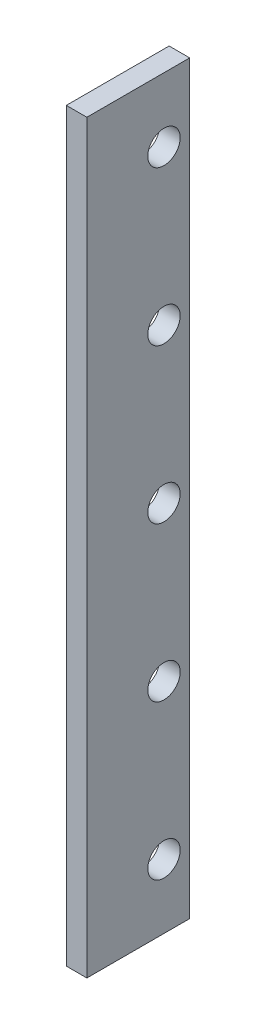
ISO-10303-21;
HEADER;
FILE_DESCRIPTION(('STEP AP214'),'2;1');
FILE_NAME('part.step','',(''),(''),'','','');
FILE_SCHEMA(('AUTOMOTIVE_DESIGN { 1 0 10303 214 1 1 1 1 }'));
ENDSEC;
DATA;
#1=APPLICATION_CONTEXT('core data for automotive mechanical design processes');
#2=APPLICATION_PROTOCOL_DEFINITION('international standard','automotive_design',2000,#1);
#3=PRODUCT_CONTEXT('',#1,'mechanical');
#4=PRODUCT('Part','Part','',(#3));
#5=PRODUCT_RELATED_PRODUCT_CATEGORY('part','',(#4));
#6=PRODUCT_DEFINITION_FORMATION('','',#4);
#7=PRODUCT_DEFINITION_CONTEXT('part definition',#1,'design');
#8=PRODUCT_DEFINITION('design','',#6,#7);
#9=PRODUCT_DEFINITION_SHAPE('','',#8);
#10=(LENGTH_UNIT() NAMED_UNIT(*) SI_UNIT(.MILLI.,.METRE.));
#11=(NAMED_UNIT(*) PLANE_ANGLE_UNIT() SI_UNIT($,.RADIAN.));
#12=(NAMED_UNIT(*) SI_UNIT($,.STERADIAN.) SOLID_ANGLE_UNIT());
#13=UNCERTAINTY_MEASURE_WITH_UNIT(LENGTH_MEASURE(1.E-05),#10,'distance_accuracy_value','');
#14=(GEOMETRIC_REPRESENTATION_CONTEXT(3) GLOBAL_UNCERTAINTY_ASSIGNED_CONTEXT((#13)) GLOBAL_UNIT_ASSIGNED_CONTEXT((#10,
#11,#12)) REPRESENTATION_CONTEXT('',''));
#15=CARTESIAN_POINT('',(0.,0.,0.));
#16=DIRECTION('',(0.,0.,1.));
#17=DIRECTION('',(1.,0.,0.));
#18=AXIS2_PLACEMENT_3D('',#15,#16,#17);
#19=CARTESIAN_POINT('',(-8.,240.,-20.));
#20=DIRECTION('',(1.,0.,0.));
#21=DIRECTION('',(0.,0.,-1.));
#22=AXIS2_PLACEMENT_3D('',#19,#20,#21);
#23=CYLINDRICAL_SURFACE('',#22,12.6);
#24=CARTESIAN_POINT('',(-8.,240.,-20.));
#25=DIRECTION('',(1.,0.,0.));
#26=DIRECTION('',(0.,0.,-1.));
#27=AXIS2_PLACEMENT_3D('',#24,#25,#26);
#28=CIRCLE('',#27,12.6);
#29=CARTESIAN_POINT('',(-8.,240.,-32.6));
#30=VERTEX_POINT('',#29);
#31=EDGE_CURVE('E49',#30,#30,#28,.T.);
#32=ORIENTED_EDGE('',*,*,#31,.F.);
#33=EDGE_LOOP('',(#32));
#34=FACE_BOUND('',#33,.T.);
#35=CARTESIAN_POINT('',(8.,240.,-20.));
#36=DIRECTION('',(1.,0.,0.));
#37=DIRECTION('',(0.,0.,-1.));
#38=AXIS2_PLACEMENT_3D('',#35,#36,#37);
#39=CIRCLE('',#38,12.6);
#40=CARTESIAN_POINT('',(8.,240.,-32.6));
#41=VERTEX_POINT('',#40);
#42=EDGE_CURVE('E11',#41,#41,#39,.T.);
#43=ORIENTED_EDGE('',*,*,#42,.T.);
#44=EDGE_LOOP('',(#43));
#45=FACE_BOUND('',#44,.T.);
#46=ADVANCED_FACE('F41',(#34,#45),#23,.F.);
#47=CARTESIAN_POINT('',(-8.,120.,-20.));
#48=DIRECTION('',(1.,0.,0.));
#49=DIRECTION('',(0.,0.,-1.));
#50=AXIS2_PLACEMENT_3D('',#47,#48,#49);
#51=CYLINDRICAL_SURFACE('',#50,12.6);
#52=CARTESIAN_POINT('',(-8.,120.,-20.));
#53=DIRECTION('',(1.,0.,0.));
#54=DIRECTION('',(0.,0.,-1.));
#55=AXIS2_PLACEMENT_3D('',#52,#53,#54);
#56=CIRCLE('',#55,12.6);
#57=CARTESIAN_POINT('',(-8.,120.,-32.6));
#58=VERTEX_POINT('',#57);
#59=EDGE_CURVE('E125',#58,#58,#56,.T.);
#60=ORIENTED_EDGE('',*,*,#59,.F.);
#61=EDGE_LOOP('',(#60));
#62=FACE_BOUND('',#61,.T.);
#63=CARTESIAN_POINT('',(8.,120.,-20.));
#64=DIRECTION('',(1.,0.,0.));
#65=DIRECTION('',(0.,0.,-1.));
#66=AXIS2_PLACEMENT_3D('',#63,#64,#65);
#67=CIRCLE('',#66,12.6);
#68=CARTESIAN_POINT('',(8.,120.,-32.6));
#69=VERTEX_POINT('',#68);
#70=EDGE_CURVE('E128',#69,#69,#67,.T.);
#71=ORIENTED_EDGE('',*,*,#70,.T.);
#72=EDGE_LOOP('',(#71));
#73=FACE_BOUND('',#72,.T.);
#74=ADVANCED_FACE('F137',(#62,#73),#51,.F.);
#75=CARTESIAN_POINT('',(-8.,0.,-20.));
#76=DIRECTION('',(1.,0.,0.));
#77=DIRECTION('',(0.,0.,-1.));
#78=AXIS2_PLACEMENT_3D('',#75,#76,#77);
#79=CYLINDRICAL_SURFACE('',#78,12.6);
#80=CARTESIAN_POINT('',(-8.,0.,-20.));
#81=DIRECTION('',(1.,0.,0.));
#82=DIRECTION('',(0.,0.,-1.));
#83=AXIS2_PLACEMENT_3D('',#80,#81,#82);
#84=CIRCLE('',#83,12.6);
#85=CARTESIAN_POINT('',(-8.,0.,-32.6));
#86=VERTEX_POINT('',#85);
#87=EDGE_CURVE('E119',#86,#86,#84,.T.);
#88=ORIENTED_EDGE('',*,*,#87,.F.);
#89=EDGE_LOOP('',(#88));
#90=FACE_BOUND('',#89,.T.);
#91=CARTESIAN_POINT('',(8.,0.,-20.));
#92=DIRECTION('',(1.,0.,0.));
#93=DIRECTION('',(0.,0.,-1.));
#94=AXIS2_PLACEMENT_3D('',#91,#92,#93);
#95=CIRCLE('',#94,12.6);
#96=CARTESIAN_POINT('',(8.,0.,-32.6));
#97=VERTEX_POINT('',#96);
#98=EDGE_CURVE('E122',#97,#97,#95,.T.);
#99=ORIENTED_EDGE('',*,*,#98,.T.);
#100=EDGE_LOOP('',(#99));
#101=FACE_BOUND('',#100,.T.);
#102=ADVANCED_FACE('F157',(#90,#101),#79,.F.);
#103=CARTESIAN_POINT('',(-8.,290.,-40.));
#104=DIRECTION('',(1.,0.,0.));
#105=DIRECTION('',(0.,0.,-1.));
#106=AXIS2_PLACEMENT_3D('',#103,#104,#105);
#107=PLANE('',#106);
#108=CARTESIAN_POINT('',(-8.,-120.,-20.));
#109=DIRECTION('',(1.,0.,0.));
#110=DIRECTION('',(0.,0.,-1.));
#111=AXIS2_PLACEMENT_3D('',#108,#109,#110);
#112=CIRCLE('',#111,12.6);
#113=CARTESIAN_POINT('',(-8.,-120.,-32.6));
#114=VERTEX_POINT('',#113);
#115=EDGE_CURVE('E247',#114,#114,#112,.T.);
#116=ORIENTED_EDGE('',*,*,#115,.T.);
#117=EDGE_LOOP('',(#116));
#118=FACE_BOUND('',#117,.T.);
#119=CARTESIAN_POINT('',(-8.,-240.,-20.));
#120=DIRECTION('',(1.,0.,0.));
#121=DIRECTION('',(0.,0.,-1.));
#122=AXIS2_PLACEMENT_3D('',#119,#120,#121);
#123=CIRCLE('',#122,12.6);
#124=CARTESIAN_POINT('',(-8.,-240.,-32.6));
#125=VERTEX_POINT('',#124);
#126=EDGE_CURVE('E112',#125,#125,#123,.T.);
#127=ORIENTED_EDGE('',*,*,#126,.T.);
#128=EDGE_LOOP('',(#127));
#129=FACE_BOUND('',#128,.T.);
#130=DIRECTION('',(0.,0.,1.));
#131=VECTOR('',#130,1.);
#132=CARTESIAN_POINT('',(-8.,-290.,-40.));
#133=LINE('',#132,#131);
#134=CARTESIAN_POINT('',(-8.,-290.,-40.));
#135=VERTEX_POINT('',#134);
#136=CARTESIAN_POINT('',(-8.,-290.,40.));
#137=VERTEX_POINT('',#136);
#138=EDGE_CURVE('E109',#135,#137,#133,.T.);
#139=ORIENTED_EDGE('',*,*,#138,.T.);
#140=DIRECTION('',(0.,-1.,0.));
#141=VECTOR('',#140,1.);
#142=CARTESIAN_POINT('',(-8.,290.,40.));
#143=LINE('',#142,#141);
#144=CARTESIAN_POINT('',(-8.,290.,40.));
#145=VERTEX_POINT('',#144);
#146=EDGE_CURVE('E99',#145,#137,#143,.T.);
#147=ORIENTED_EDGE('',*,*,#146,.F.);
#148=DIRECTION('',(0.,0.,1.));
#149=VECTOR('',#148,1.);
#150=CARTESIAN_POINT('',(-8.,290.,-40.));
#151=LINE('',#150,#149);
#152=CARTESIAN_POINT('',(-8.,290.,-40.));
#153=VERTEX_POINT('',#152);
#154=EDGE_CURVE('E93',#153,#145,#151,.T.);
#155=ORIENTED_EDGE('',*,*,#154,.F.);
#156=DIRECTION('',(0.,-1.,0.));
#157=VECTOR('',#156,1.);
#158=CARTESIAN_POINT('',(-8.,290.,-40.));
#159=LINE('',#158,#157);
#160=EDGE_CURVE('E105',#153,#135,#159,.T.);
#161=ORIENTED_EDGE('',*,*,#160,.T.);
#162=EDGE_LOOP('',(#139,#147,#155,#161));
#163=FACE_BOUND('',#162,.T.);
#164=ORIENTED_EDGE('',*,*,#87,.T.);
#165=EDGE_LOOP('',(#164));
#166=FACE_BOUND('',#165,.T.);
#167=ORIENTED_EDGE('',*,*,#59,.T.);
#168=EDGE_LOOP('',(#167));
#169=FACE_BOUND('',#168,.T.);
#170=ORIENTED_EDGE('',*,*,#31,.T.);
#171=EDGE_LOOP('',(#170));
#172=FACE_BOUND('',#171,.T.);
#173=ADVANCED_FACE('F133',(#118,#129,#163,#166,#169,#172),#107,.F.);
#174=CARTESIAN_POINT('',(8.,290.,40.));
#175=DIRECTION('',(0.,0.,-1.));
#176=DIRECTION('',(-1.,0.,0.));
#177=AXIS2_PLACEMENT_3D('',#174,#175,#176);
#178=PLANE('',#177);
#179=DIRECTION('',(1.,0.,0.));
#180=VECTOR('',#179,1.);
#181=CARTESIAN_POINT('',(8.,-290.,40.));
#182=LINE('',#181,#180);
#183=CARTESIAN_POINT('',(8.,-290.,40.));
#184=VERTEX_POINT('',#183);
#185=EDGE_CURVE('E98',#137,#184,#182,.T.);
#186=ORIENTED_EDGE('',*,*,#185,.T.);
#187=DIRECTION('',(0.,-1.,0.));
#188=VECTOR('',#187,1.);
#189=CARTESIAN_POINT('',(8.,290.,40.));
#190=LINE('',#189,#188);
#191=CARTESIAN_POINT('',(8.,290.,40.));
#192=VERTEX_POINT('',#191);
#193=EDGE_CURVE('E96',#192,#184,#190,.T.);
#194=ORIENTED_EDGE('',*,*,#193,.F.);
#195=DIRECTION('',(1.,0.,0.));
#196=VECTOR('',#195,1.);
#197=CARTESIAN_POINT('',(8.,290.,40.));
#198=LINE('',#197,#196);
#199=EDGE_CURVE('E88',#145,#192,#198,.T.);
#200=ORIENTED_EDGE('',*,*,#199,.F.);
#201=ORIENTED_EDGE('',*,*,#146,.T.);
#202=EDGE_LOOP('',(#186,#194,#200,#201));
#203=FACE_BOUND('',#202,.T.);
#204=ADVANCED_FACE('F97',(#203),#178,.F.);
#205=CARTESIAN_POINT('',(8.,290.,-40.));
#206=DIRECTION('',(-1.,0.,0.));
#207=DIRECTION('',(0.,0.,1.));
#208=AXIS2_PLACEMENT_3D('',#205,#206,#207);
#209=PLANE('',#208);
#210=CARTESIAN_POINT('',(8.,-120.,-20.));
#211=DIRECTION('',(1.,0.,0.));
#212=DIRECTION('',(0.,0.,-1.));
#213=AXIS2_PLACEMENT_3D('',#210,#211,#212);
#214=CIRCLE('',#213,12.6);
#215=CARTESIAN_POINT('',(8.,-120.,-32.6));
#216=VERTEX_POINT('',#215);
#217=EDGE_CURVE('E249',#216,#216,#214,.T.);
#218=ORIENTED_EDGE('',*,*,#217,.F.);
#219=EDGE_LOOP('',(#218));
#220=FACE_BOUND('',#219,.T.);
#221=CARTESIAN_POINT('',(8.,-240.,-20.));
#222=DIRECTION('',(1.,0.,0.));
#223=DIRECTION('',(0.,0.,-1.));
#224=AXIS2_PLACEMENT_3D('',#221,#222,#223);
#225=CIRCLE('',#224,12.6);
#226=CARTESIAN_POINT('',(8.,-240.,-32.6));
#227=VERTEX_POINT('',#226);
#228=EDGE_CURVE('E250',#227,#227,#225,.T.);
#229=ORIENTED_EDGE('',*,*,#228,.F.);
#230=EDGE_LOOP('',(#229));
#231=FACE_BOUND('',#230,.T.);
#232=DIRECTION('',(0.,0.,-1.));
#233=VECTOR('',#232,1.);
#234=CARTESIAN_POINT('',(8.,-290.,-40.));
#235=LINE('',#234,#233);
#236=CARTESIAN_POINT('',(8.,-290.,-40.));
#237=VERTEX_POINT('',#236);
#238=EDGE_CURVE('E74',#184,#237,#235,.T.);
#239=ORIENTED_EDGE('',*,*,#238,.T.);
#240=DIRECTION('',(0.,-1.,0.));
#241=VECTOR('',#240,1.);
#242=CARTESIAN_POINT('',(8.,290.,-40.));
#243=LINE('',#242,#241);
#244=CARTESIAN_POINT('',(8.,290.,-40.));
#245=VERTEX_POINT('',#244);
#246=EDGE_CURVE('E100',#245,#237,#243,.T.);
#247=ORIENTED_EDGE('',*,*,#246,.F.);
#248=DIRECTION('',(0.,0.,-1.));
#249=VECTOR('',#248,1.);
#250=CARTESIAN_POINT('',(8.,290.,-40.));
#251=LINE('',#250,#249);
#252=EDGE_CURVE('E91',#192,#245,#251,.T.);
#253=ORIENTED_EDGE('',*,*,#252,.F.);
#254=ORIENTED_EDGE('',*,*,#193,.T.);
#255=EDGE_LOOP('',(#239,#247,#253,#254));
#256=FACE_BOUND('',#255,.T.);
#257=ORIENTED_EDGE('',*,*,#98,.F.);
#258=EDGE_LOOP('',(#257));
#259=FACE_BOUND('',#258,.T.);
#260=ORIENTED_EDGE('',*,*,#70,.F.);
#261=EDGE_LOOP('',(#260));
#262=FACE_BOUND('',#261,.T.);
#263=ORIENTED_EDGE('',*,*,#42,.F.);
#264=EDGE_LOOP('',(#263));
#265=FACE_BOUND('',#264,.T.);
#266=ADVANCED_FACE('F102',(#220,#231,#256,#259,#262,#265),#209,.F.);
#267=CARTESIAN_POINT('',(8.,290.,-40.));
#268=DIRECTION('',(0.,0.,1.));
#269=DIRECTION('',(1.,0.,0.));
#270=AXIS2_PLACEMENT_3D('',#267,#268,#269);
#271=PLANE('',#270);
#272=DIRECTION('',(-1.,0.,0.));
#273=VECTOR('',#272,1.);
#274=CARTESIAN_POINT('',(8.,-290.,-40.));
#275=LINE('',#274,#273);
#276=EDGE_CURVE('E80',#237,#135,#275,.T.);
#277=ORIENTED_EDGE('',*,*,#276,.T.);
#278=ORIENTED_EDGE('',*,*,#160,.F.);
#279=DIRECTION('',(-1.,0.,0.));
#280=VECTOR('',#279,1.);
#281=CARTESIAN_POINT('',(8.,290.,-40.));
#282=LINE('',#281,#280);
#283=EDGE_CURVE('E57',#245,#153,#282,.T.);
#284=ORIENTED_EDGE('',*,*,#283,.F.);
#285=ORIENTED_EDGE('',*,*,#246,.T.);
#286=EDGE_LOOP('',(#277,#278,#284,#285));
#287=FACE_BOUND('',#286,.T.);
#288=ADVANCED_FACE('F141',(#287),#271,.F.);
#289=CARTESIAN_POINT('',(0.,290.,0.));
#290=DIRECTION('',(0.,-1.,0.));
#291=DIRECTION('',(0.,0.,-1.));
#292=AXIS2_PLACEMENT_3D('',#289,#290,#291);
#293=PLANE('',#292);
#294=ORIENTED_EDGE('',*,*,#154,.T.);
#295=ORIENTED_EDGE('',*,*,#199,.T.);
#296=ORIENTED_EDGE('',*,*,#252,.T.);
#297=ORIENTED_EDGE('',*,*,#283,.T.);
#298=EDGE_LOOP('',(#294,#295,#296,#297));
#299=FACE_BOUND('',#298,.T.);
#300=ADVANCED_FACE('F89',(#299),#293,.F.);
#301=CARTESIAN_POINT('',(0.,-290.,0.));
#302=DIRECTION('',(0.,-1.,0.));
#303=DIRECTION('',(0.,0.,-1.));
#304=AXIS2_PLACEMENT_3D('',#301,#302,#303);
#305=PLANE('',#304);
#306=ORIENTED_EDGE('',*,*,#138,.F.);
#307=ORIENTED_EDGE('',*,*,#276,.F.);
#308=ORIENTED_EDGE('',*,*,#238,.F.);
#309=ORIENTED_EDGE('',*,*,#185,.F.);
#310=EDGE_LOOP('',(#306,#307,#308,#309));
#311=FACE_BOUND('',#310,.T.);
#312=ADVANCED_FACE('F210',(#311),#305,.T.);
#313=CARTESIAN_POINT('',(-8.,-240.,-20.));
#314=DIRECTION('',(1.,0.,0.));
#315=DIRECTION('',(0.,0.,-1.));
#316=AXIS2_PLACEMENT_3D('',#313,#314,#315);
#317=CYLINDRICAL_SURFACE('',#316,12.6);
#318=ORIENTED_EDGE('',*,*,#126,.F.);
#319=EDGE_LOOP('',(#318));
#320=FACE_BOUND('',#319,.T.);
#321=ORIENTED_EDGE('',*,*,#228,.T.);
#322=EDGE_LOOP('',(#321));
#323=FACE_BOUND('',#322,.T.);
#324=ADVANCED_FACE('F219',(#320,#323),#317,.F.);
#325=CARTESIAN_POINT('',(-8.,-120.,-20.));
#326=DIRECTION('',(1.,0.,0.));
#327=DIRECTION('',(0.,0.,-1.));
#328=AXIS2_PLACEMENT_3D('',#325,#326,#327);
#329=CYLINDRICAL_SURFACE('',#328,12.6);
#330=ORIENTED_EDGE('',*,*,#115,.F.);
#331=EDGE_LOOP('',(#330));
#332=FACE_BOUND('',#331,.T.);
#333=ORIENTED_EDGE('',*,*,#217,.T.);
#334=EDGE_LOOP('',(#333));
#335=FACE_BOUND('',#334,.T.);
#336=ADVANCED_FACE('F226',(#332,#335),#329,.F.);
#337=CLOSED_SHELL('',(#46,#74,#102,#173,#204,#266,#288,#300,#312,#324,#336));
#338=MANIFOLD_SOLID_BREP('B2',#337);
#339=ADVANCED_BREP_SHAPE_REPRESENTATION('',(#18,#338),#14);
#340=SHAPE_DEFINITION_REPRESENTATION(#9,#339);
ENDSEC;
END-ISO-10303-21;
